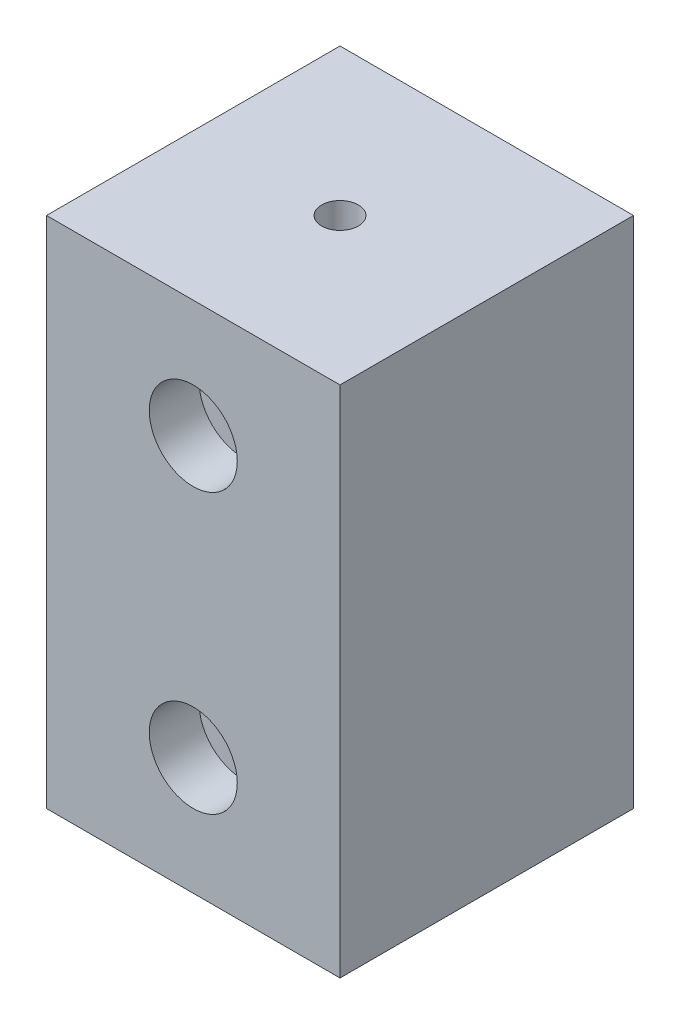
ISO-10303-21;
HEADER;
FILE_DESCRIPTION(('STEP AP214'),'2;1');
FILE_NAME('part.step','',(''),(''),'','','');
FILE_SCHEMA(('AUTOMOTIVE_DESIGN { 1 0 10303 214 1 1 1 1 }'));
ENDSEC;
DATA;
#1=APPLICATION_CONTEXT('core data for automotive mechanical design processes');
#2=APPLICATION_PROTOCOL_DEFINITION('international standard','automotive_design',2000,#1);
#3=PRODUCT_CONTEXT('',#1,'mechanical');
#4=PRODUCT('Part','Part','',(#3));
#5=PRODUCT_RELATED_PRODUCT_CATEGORY('part','',(#4));
#6=PRODUCT_DEFINITION_FORMATION('','',#4);
#7=PRODUCT_DEFINITION_CONTEXT('part definition',#1,'design');
#8=PRODUCT_DEFINITION('design','',#6,#7);
#9=PRODUCT_DEFINITION_SHAPE('','',#8);
#10=(LENGTH_UNIT() NAMED_UNIT(*) SI_UNIT(.MILLI.,.METRE.));
#11=(NAMED_UNIT(*) PLANE_ANGLE_UNIT() SI_UNIT($,.RADIAN.));
#12=(NAMED_UNIT(*) SI_UNIT($,.STERADIAN.) SOLID_ANGLE_UNIT());
#13=UNCERTAINTY_MEASURE_WITH_UNIT(LENGTH_MEASURE(1.E-05),#10,'distance_accuracy_value','');
#14=(GEOMETRIC_REPRESENTATION_CONTEXT(3) GLOBAL_UNCERTAINTY_ASSIGNED_CONTEXT((#13)) GLOBAL_UNIT_ASSIGNED_CONTEXT((#10,
#11,#12)) REPRESENTATION_CONTEXT('',''));
#15=CARTESIAN_POINT('',(0.,0.,0.));
#16=DIRECTION('',(0.,0.,1.));
#17=DIRECTION('',(1.,0.,0.));
#18=AXIS2_PLACEMENT_3D('',#15,#16,#17);
#19=CARTESIAN_POINT('',(-10.,17.4999999999999,20.));
#20=DIRECTION('',(0.,1.,0.));
#21=DIRECTION('',(0.,0.,1.));
#22=AXIS2_PLACEMENT_3D('',#19,#20,#21);
#23=PLANE('',#22);
#24=CARTESIAN_POINT('',(0.,17.4999999999999,10.));
#25=DIRECTION('',(0.,1.,0.));
#26=DIRECTION('',(0.,0.,1.));
#27=AXIS2_PLACEMENT_3D('',#24,#25,#26);
#28=CIRCLE('',#27,1.24999999999999);
#29=CARTESIAN_POINT('',(0.,17.4999999999999,11.25));
#30=VERTEX_POINT('',#29);
#31=EDGE_CURVE('E100',#30,#30,#28,.T.);
#32=ORIENTED_EDGE('',*,*,#31,.F.);
#33=EDGE_LOOP('',(#32));
#34=FACE_BOUND('',#33,.T.);
#35=DIRECTION('',(1.,0.,0.));
#36=VECTOR('',#35,1.);
#37=CARTESIAN_POINT('',(-10.,17.4999999999999,0.));
#38=LINE('',#37,#36);
#39=CARTESIAN_POINT('',(-10.,17.4999999999999,0.));
#40=VERTEX_POINT('',#39);
#41=CARTESIAN_POINT('',(10.,17.4999999999999,0.));
#42=VERTEX_POINT('',#41);
#43=EDGE_CURVE('E137',#40,#42,#38,.T.);
#44=ORIENTED_EDGE('',*,*,#43,.F.);
#45=DIRECTION('',(0.,0.,-1.));
#46=VECTOR('',#45,1.);
#47=CARTESIAN_POINT('',(-10.,17.4999999999999,20.));
#48=LINE('',#47,#46);
#49=CARTESIAN_POINT('',(-10.,17.4999999999999,20.));
#50=VERTEX_POINT('',#49);
#51=EDGE_CURVE('E11',#50,#40,#48,.T.);
#52=ORIENTED_EDGE('',*,*,#51,.F.);
#53=DIRECTION('',(1.,0.,0.));
#54=VECTOR('',#53,1.);
#55=CARTESIAN_POINT('',(-10.,17.4999999999999,20.));
#56=LINE('',#55,#54);
#57=CARTESIAN_POINT('',(10.,17.4999999999999,20.));
#58=VERTEX_POINT('',#57);
#59=EDGE_CURVE('E138',#50,#58,#56,.T.);
#60=ORIENTED_EDGE('',*,*,#59,.T.);
#61=DIRECTION('',(0.,0.,-1.));
#62=VECTOR('',#61,1.);
#63=CARTESIAN_POINT('',(10.,17.4999999999999,20.));
#64=LINE('',#63,#62);
#65=EDGE_CURVE('E43',#58,#42,#64,.T.);
#66=ORIENTED_EDGE('',*,*,#65,.T.);
#67=EDGE_LOOP('',(#44,#52,#60,#66));
#68=FACE_BOUND('',#67,.T.);
#69=ADVANCED_FACE('F40',(#34,#68),#23,.T.);
#70=CARTESIAN_POINT('',(-10.,17.4999999999999,20.));
#71=DIRECTION('',(1.,0.,0.));
#72=DIRECTION('',(0.,1.,0.));
#73=AXIS2_PLACEMENT_3D('',#70,#71,#72);
#74=PLANE('',#73);
#75=DIRECTION('',(0.,-1.,0.));
#76=VECTOR('',#75,1.);
#77=CARTESIAN_POINT('',(-10.,17.4999999999999,0.));
#78=LINE('',#77,#76);
#79=CARTESIAN_POINT('',(-10.,-17.4999999999999,0.));
#80=VERTEX_POINT('',#79);
#81=EDGE_CURVE('E75',#40,#80,#78,.T.);
#82=ORIENTED_EDGE('',*,*,#81,.T.);
#83=DIRECTION('',(0.,0.,-1.));
#84=VECTOR('',#83,1.);
#85=CARTESIAN_POINT('',(-10.,-17.4999999999999,20.));
#86=LINE('',#85,#84);
#87=CARTESIAN_POINT('',(-10.,-17.4999999999999,20.));
#88=VERTEX_POINT('',#87);
#89=EDGE_CURVE('E50',#88,#80,#86,.T.);
#90=ORIENTED_EDGE('',*,*,#89,.F.);
#91=DIRECTION('',(0.,-1.,0.));
#92=VECTOR('',#91,1.);
#93=CARTESIAN_POINT('',(-10.,17.4999999999999,20.));
#94=LINE('',#93,#92);
#95=EDGE_CURVE('E147',#50,#88,#94,.T.);
#96=ORIENTED_EDGE('',*,*,#95,.F.);
#97=ORIENTED_EDGE('',*,*,#51,.T.);
#98=EDGE_LOOP('',(#82,#90,#96,#97));
#99=FACE_BOUND('',#98,.T.);
#100=ADVANCED_FACE('F176',(#99),#74,.F.);
#101=CARTESIAN_POINT('',(-10.,-17.4999999999999,20.));
#102=DIRECTION('',(0.,1.,0.));
#103=DIRECTION('',(0.,0.,1.));
#104=AXIS2_PLACEMENT_3D('',#101,#102,#103);
#105=PLANE('',#104);
#106=DIRECTION('',(1.,0.,0.));
#107=VECTOR('',#106,1.);
#108=CARTESIAN_POINT('',(-10.,-17.4999999999999,0.));
#109=LINE('',#108,#107);
#110=CARTESIAN_POINT('',(10.,-17.4999999999999,0.));
#111=VERTEX_POINT('',#110);
#112=EDGE_CURVE('E157',#80,#111,#109,.T.);
#113=ORIENTED_EDGE('',*,*,#112,.T.);
#114=DIRECTION('',(0.,0.,-1.));
#115=VECTOR('',#114,1.);
#116=CARTESIAN_POINT('',(10.,-17.4999999999999,20.));
#117=LINE('',#116,#115);
#118=CARTESIAN_POINT('',(10.,-17.4999999999999,20.));
#119=VERTEX_POINT('',#118);
#120=EDGE_CURVE('E164',#119,#111,#117,.T.);
#121=ORIENTED_EDGE('',*,*,#120,.F.);
#122=DIRECTION('',(1.,0.,0.));
#123=VECTOR('',#122,1.);
#124=CARTESIAN_POINT('',(-10.,-17.4999999999999,20.));
#125=LINE('',#124,#123);
#126=EDGE_CURVE('E144',#88,#119,#125,.T.);
#127=ORIENTED_EDGE('',*,*,#126,.F.);
#128=ORIENTED_EDGE('',*,*,#89,.T.);
#129=EDGE_LOOP('',(#113,#121,#127,#128));
#130=FACE_BOUND('',#129,.T.);
#131=ADVANCED_FACE('F174',(#130),#105,.F.);
#132=CARTESIAN_POINT('',(10.,17.4999999999999,20.));
#133=DIRECTION('',(1.,0.,0.));
#134=DIRECTION('',(0.,1.,0.));
#135=AXIS2_PLACEMENT_3D('',#132,#133,#134);
#136=PLANE('',#135);
#137=DIRECTION('',(0.,-1.,0.));
#138=VECTOR('',#137,1.);
#139=CARTESIAN_POINT('',(10.,17.4999999999999,0.));
#140=LINE('',#139,#138);
#141=EDGE_CURVE('E153',#42,#111,#140,.T.);
#142=ORIENTED_EDGE('',*,*,#141,.F.);
#143=ORIENTED_EDGE('',*,*,#65,.F.);
#144=DIRECTION('',(0.,-1.,0.));
#145=VECTOR('',#144,1.);
#146=CARTESIAN_POINT('',(10.,17.4999999999999,20.));
#147=LINE('',#146,#145);
#148=EDGE_CURVE('E141',#58,#119,#147,.T.);
#149=ORIENTED_EDGE('',*,*,#148,.T.);
#150=ORIENTED_EDGE('',*,*,#120,.T.);
#151=EDGE_LOOP('',(#142,#143,#149,#150));
#152=FACE_BOUND('',#151,.T.);
#153=ADVANCED_FACE('F169',(#152),#136,.T.);
#154=CARTESIAN_POINT('',(0.,0.,20.));
#155=DIRECTION('',(0.,0.,-1.));
#156=DIRECTION('',(-1.,0.,0.));
#157=AXIS2_PLACEMENT_3D('',#154,#155,#156);
#158=PLANE('',#157);
#159=CARTESIAN_POINT('',(0.,9.49999999999986,20.));
#160=DIRECTION('',(0.,0.,1.));
#161=DIRECTION('',(1.,0.,0.));
#162=AXIS2_PLACEMENT_3D('',#159,#160,#161);
#163=CIRCLE('',#162,3.);
#164=CARTESIAN_POINT('',(3.,9.49999999999986,20.));
#165=VERTEX_POINT('',#164);
#166=EDGE_CURVE('E99',#165,#165,#163,.T.);
#167=ORIENTED_EDGE('',*,*,#166,.F.);
#168=EDGE_LOOP('',(#167));
#169=FACE_BOUND('',#168,.T.);
#170=CARTESIAN_POINT('',(0.,-9.49999999999986,20.));
#171=DIRECTION('',(0.,0.,1.));
#172=DIRECTION('',(1.,0.,0.));
#173=AXIS2_PLACEMENT_3D('',#170,#171,#172);
#174=CIRCLE('',#173,3.);
#175=CARTESIAN_POINT('',(3.,-9.49999999999986,20.));
#176=VERTEX_POINT('',#175);
#177=EDGE_CURVE('E121',#176,#176,#174,.T.);
#178=ORIENTED_EDGE('',*,*,#177,.F.);
#179=EDGE_LOOP('',(#178));
#180=FACE_BOUND('',#179,.T.);
#181=ORIENTED_EDGE('',*,*,#59,.F.);
#182=ORIENTED_EDGE('',*,*,#95,.T.);
#183=ORIENTED_EDGE('',*,*,#126,.T.);
#184=ORIENTED_EDGE('',*,*,#148,.F.);
#185=EDGE_LOOP('',(#181,#182,#183,#184));
#186=FACE_BOUND('',#185,.T.);
#187=ADVANCED_FACE('F178',(#169,#180,#186),#158,.F.);
#188=CARTESIAN_POINT('',(0.,0.,0.));
#189=DIRECTION('',(0.,0.,-1.));
#190=DIRECTION('',(-1.,0.,0.));
#191=AXIS2_PLACEMENT_3D('',#188,#189,#190);
#192=PLANE('',#191);
#193=CARTESIAN_POINT('',(0.,9.49999999999986,0.));
#194=DIRECTION('',(0.,0.,1.));
#195=DIRECTION('',(1.,0.,0.));
#196=AXIS2_PLACEMENT_3D('',#193,#194,#195);
#197=CIRCLE('',#196,1.59999999999999);
#198=CARTESIAN_POINT('',(1.59999999999999,9.49999999999986,0.));
#199=VERTEX_POINT('',#198);
#200=EDGE_CURVE('E117',#199,#199,#197,.T.);
#201=ORIENTED_EDGE('',*,*,#200,.T.);
#202=EDGE_LOOP('',(#201));
#203=FACE_BOUND('',#202,.T.);
#204=CARTESIAN_POINT('',(0.,-9.49999999999986,0.));
#205=DIRECTION('',(0.,0.,1.));
#206=DIRECTION('',(1.,0.,0.));
#207=AXIS2_PLACEMENT_3D('',#204,#205,#206);
#208=CIRCLE('',#207,1.59999999999999);
#209=CARTESIAN_POINT('',(1.59999999999999,-9.49999999999986,0.));
#210=VERTEX_POINT('',#209);
#211=EDGE_CURVE('E133',#210,#210,#208,.T.);
#212=ORIENTED_EDGE('',*,*,#211,.T.);
#213=EDGE_LOOP('',(#212));
#214=FACE_BOUND('',#213,.T.);
#215=ORIENTED_EDGE('',*,*,#43,.T.);
#216=ORIENTED_EDGE('',*,*,#141,.T.);
#217=ORIENTED_EDGE('',*,*,#112,.F.);
#218=ORIENTED_EDGE('',*,*,#81,.F.);
#219=EDGE_LOOP('',(#215,#216,#217,#218));
#220=FACE_BOUND('',#219,.T.);
#221=ADVANCED_FACE('F172',(#203,#214,#220),#192,.T.);
#222=CARTESIAN_POINT('',(0.,-9.49999999999986,20.));
#223=DIRECTION('',(0.,0.,1.));
#224=DIRECTION('',(1.,0.,0.));
#225=AXIS2_PLACEMENT_3D('',#222,#223,#224);
#226=CYLINDRICAL_SURFACE('',#225,1.6);
#227=ORIENTED_EDGE('',*,*,#211,.F.);
#228=EDGE_LOOP('',(#227));
#229=FACE_BOUND('',#228,.T.);
#230=CARTESIAN_POINT('',(0.,-9.49999999999986,16.6));
#231=DIRECTION('',(0.,0.,1.));
#232=DIRECTION('',(1.,0.,0.));
#233=AXIS2_PLACEMENT_3D('',#230,#231,#232);
#234=CIRCLE('',#233,1.60000000000001);
#235=CARTESIAN_POINT('',(1.60000000000001,-9.49999999999986,16.6));
#236=VERTEX_POINT('',#235);
#237=EDGE_CURVE('E129',#236,#236,#234,.T.);
#238=ORIENTED_EDGE('',*,*,#237,.T.);
#239=EDGE_LOOP('',(#238));
#240=FACE_BOUND('',#239,.T.);
#241=ADVANCED_FACE('F186',(#229,#240),#226,.F.);
#242=CARTESIAN_POINT('',(1.60000000000001,-9.49999999999986,16.6));
#243=DIRECTION('',(0.,0.,-1.));
#244=DIRECTION('',(-1.,0.,0.));
#245=AXIS2_PLACEMENT_3D('',#242,#243,#244);
#246=PLANE('',#245);
#247=ORIENTED_EDGE('',*,*,#237,.F.);
#248=EDGE_LOOP('',(#247));
#249=FACE_BOUND('',#248,.T.);
#250=CARTESIAN_POINT('',(0.,-9.49999999999986,16.6));
#251=DIRECTION('',(0.,0.,1.));
#252=DIRECTION('',(1.,0.,0.));
#253=AXIS2_PLACEMENT_3D('',#250,#251,#252);
#254=CIRCLE('',#253,3.);
#255=CARTESIAN_POINT('',(3.,-9.49999999999986,16.6));
#256=VERTEX_POINT('',#255);
#257=EDGE_CURVE('E125',#256,#256,#254,.T.);
#258=ORIENTED_EDGE('',*,*,#257,.T.);
#259=EDGE_LOOP('',(#258));
#260=FACE_BOUND('',#259,.T.);
#261=ADVANCED_FACE('F219',(#249,#260),#246,.F.);
#262=CARTESIAN_POINT('',(0.,-9.49999999999986,20.));
#263=DIRECTION('',(0.,0.,1.));
#264=DIRECTION('',(1.,0.,0.));
#265=AXIS2_PLACEMENT_3D('',#262,#263,#264);
#266=CYLINDRICAL_SURFACE('',#265,3.);
#267=ORIENTED_EDGE('',*,*,#257,.F.);
#268=EDGE_LOOP('',(#267));
#269=FACE_BOUND('',#268,.T.);
#270=ORIENTED_EDGE('',*,*,#177,.T.);
#271=EDGE_LOOP('',(#270));
#272=FACE_BOUND('',#271,.T.);
#273=ADVANCED_FACE('F215',(#269,#272),#266,.F.);
#274=CARTESIAN_POINT('',(0.,9.49999999999986,20.));
#275=DIRECTION('',(0.,0.,1.));
#276=DIRECTION('',(1.,0.,0.));
#277=AXIS2_PLACEMENT_3D('',#274,#275,#276);
#278=CYLINDRICAL_SURFACE('',#277,1.6);
#279=ORIENTED_EDGE('',*,*,#200,.F.);
#280=EDGE_LOOP('',(#279));
#281=FACE_BOUND('',#280,.T.);
#282=CARTESIAN_POINT('',(0.,9.49999999999986,16.6));
#283=DIRECTION('',(0.,0.,1.));
#284=DIRECTION('',(1.,0.,0.));
#285=AXIS2_PLACEMENT_3D('',#282,#283,#284);
#286=CIRCLE('',#285,1.60000000000001);
#287=CARTESIAN_POINT('',(1.60000000000001,9.49999999999986,16.6));
#288=VERTEX_POINT('',#287);
#289=EDGE_CURVE('E113',#288,#288,#286,.T.);
#290=ORIENTED_EDGE('',*,*,#289,.T.);
#291=EDGE_LOOP('',(#290));
#292=FACE_BOUND('',#291,.T.);
#293=ADVANCED_FACE('F211',(#281,#292),#278,.F.);
#294=CARTESIAN_POINT('',(1.60000000000001,9.49999999999986,16.6));
#295=DIRECTION('',(0.,0.,-1.));
#296=DIRECTION('',(-1.,0.,0.));
#297=AXIS2_PLACEMENT_3D('',#294,#295,#296);
#298=PLANE('',#297);
#299=ORIENTED_EDGE('',*,*,#289,.F.);
#300=EDGE_LOOP('',(#299));
#301=FACE_BOUND('',#300,.T.);
#302=CARTESIAN_POINT('',(0.,9.49999999999986,16.6));
#303=DIRECTION('',(0.,0.,1.));
#304=DIRECTION('',(1.,0.,0.));
#305=AXIS2_PLACEMENT_3D('',#302,#303,#304);
#306=CIRCLE('',#305,3.);
#307=CARTESIAN_POINT('',(3.,9.49999999999986,16.6));
#308=VERTEX_POINT('',#307);
#309=EDGE_CURVE('E105',#308,#308,#306,.T.);
#310=ORIENTED_EDGE('',*,*,#309,.T.);
#311=EDGE_LOOP('',(#310));
#312=FACE_BOUND('',#311,.T.);
#313=ADVANCED_FACE('F207',(#301,#312),#298,.F.);
#314=CARTESIAN_POINT('',(0.,9.49999999999986,20.));
#315=DIRECTION('',(0.,0.,1.));
#316=DIRECTION('',(1.,0.,0.));
#317=AXIS2_PLACEMENT_3D('',#314,#315,#316);
#318=CYLINDRICAL_SURFACE('',#317,3.);
#319=ORIENTED_EDGE('',*,*,#309,.F.);
#320=EDGE_LOOP('',(#319));
#321=FACE_BOUND('',#320,.T.);
#322=ORIENTED_EDGE('',*,*,#166,.T.);
#323=EDGE_LOOP('',(#322));
#324=FACE_BOUND('',#323,.T.);
#325=ADVANCED_FACE('F92',(#321,#324),#318,.F.);
#326=CARTESIAN_POINT('',(0.,12.4999999999999,10.));
#327=DIRECTION('',(0.,1.,0.));
#328=DIRECTION('',(0.,0.,1.));
#329=AXIS2_PLACEMENT_3D('',#326,#327,#328);
#330=CONICAL_SURFACE('',#329,1.25,1.02974425867665);
#331=CARTESIAN_POINT('',(0.,11.7489242262154,10.));
#332=VERTEX_POINT('',#331);
#333=VERTEX_LOOP('',#332);
#334=FACE_BOUND('',#333,.T.);
#335=CARTESIAN_POINT('',(0.,12.4999999999999,10.));
#336=DIRECTION('',(0.,1.,0.));
#337=DIRECTION('',(0.,0.,1.));
#338=AXIS2_PLACEMENT_3D('',#335,#336,#337);
#339=CIRCLE('',#338,1.25);
#340=CARTESIAN_POINT('',(0.,12.4999999999999,11.25));
#341=VERTEX_POINT('',#340);
#342=EDGE_CURVE('E96',#341,#341,#339,.T.);
#343=ORIENTED_EDGE('',*,*,#342,.T.);
#344=EDGE_LOOP('',(#343));
#345=FACE_BOUND('',#344,.T.);
#346=ADVANCED_FACE('F88',(#334,#345),#330,.F.);
#347=CARTESIAN_POINT('',(0.,17.4999999999999,10.));
#348=DIRECTION('',(0.,1.,0.));
#349=DIRECTION('',(0.,0.,1.));
#350=AXIS2_PLACEMENT_3D('',#347,#348,#349);
#351=CYLINDRICAL_SURFACE('',#350,1.24999999999999);
#352=ORIENTED_EDGE('',*,*,#342,.F.);
#353=EDGE_LOOP('',(#352));
#354=FACE_BOUND('',#353,.T.);
#355=ORIENTED_EDGE('',*,*,#31,.T.);
#356=EDGE_LOOP('',(#355));
#357=FACE_BOUND('',#356,.T.);
#358=ADVANCED_FACE('F91',(#354,#357),#351,.F.);
#359=CLOSED_SHELL('',(#69,#100,#131,#153,#187,#221,#241,#261,#273,#293,#313,#325,#346,#358));
#360=MANIFOLD_SOLID_BREP('B2',#359);
#361=ADVANCED_BREP_SHAPE_REPRESENTATION('',(#18,#360),#14);
#362=SHAPE_DEFINITION_REPRESENTATION(#9,#361);
ENDSEC;
END-ISO-10303-21;
